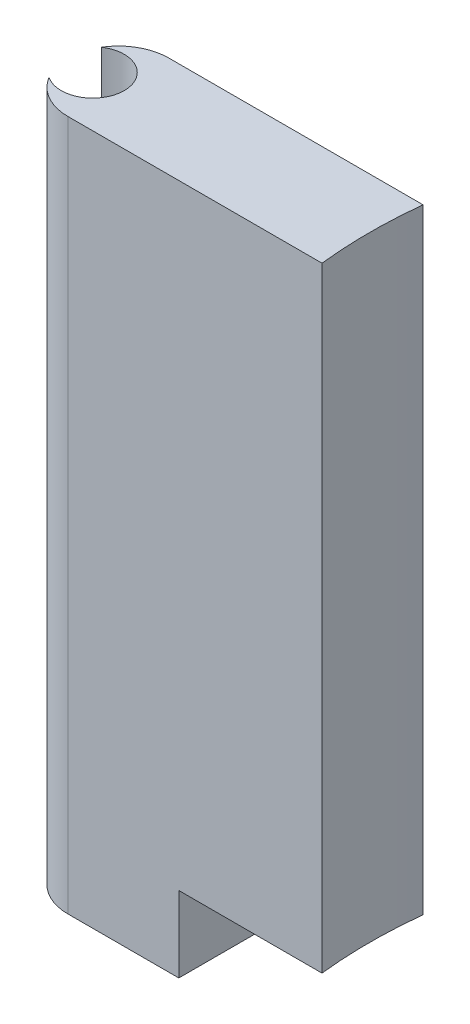
ISO-10303-21;
HEADER;
FILE_DESCRIPTION(('STEP AP214'),'2;1');
FILE_NAME('part.step','',(''),(''),'','','');
FILE_SCHEMA(('AUTOMOTIVE_DESIGN { 1 0 10303 214 1 1 1 1 }'));
ENDSEC;
DATA;
#1=APPLICATION_CONTEXT('core data for automotive mechanical design processes');
#2=APPLICATION_PROTOCOL_DEFINITION('international standard','automotive_design',2000,#1);
#3=PRODUCT_CONTEXT('',#1,'mechanical');
#4=PRODUCT('Part','Part','',(#3));
#5=PRODUCT_RELATED_PRODUCT_CATEGORY('part','',(#4));
#6=PRODUCT_DEFINITION_FORMATION('','',#4);
#7=PRODUCT_DEFINITION_CONTEXT('part definition',#1,'design');
#8=PRODUCT_DEFINITION('design','',#6,#7);
#9=PRODUCT_DEFINITION_SHAPE('','',#8);
#10=(LENGTH_UNIT() NAMED_UNIT(*) SI_UNIT(.MILLI.,.METRE.));
#11=(NAMED_UNIT(*) PLANE_ANGLE_UNIT() SI_UNIT($,.RADIAN.));
#12=(NAMED_UNIT(*) SI_UNIT($,.STERADIAN.) SOLID_ANGLE_UNIT());
#13=UNCERTAINTY_MEASURE_WITH_UNIT(LENGTH_MEASURE(1.E-05),#10,'distance_accuracy_value','');
#14=(GEOMETRIC_REPRESENTATION_CONTEXT(3) GLOBAL_UNCERTAINTY_ASSIGNED_CONTEXT((#13)) GLOBAL_UNIT_ASSIGNED_CONTEXT((#10,
#11,#12)) REPRESENTATION_CONTEXT('',''));
#15=CARTESIAN_POINT('',(0.,0.,0.));
#16=DIRECTION('',(0.,0.,1.));
#17=DIRECTION('',(1.,0.,0.));
#18=AXIS2_PLACEMENT_3D('',#15,#16,#17);
#19=CARTESIAN_POINT('',(-107.430277486441,104.14,0.));
#20=DIRECTION('',(0.,-1.,0.));
#21=DIRECTION('',(0.,0.,-1.));
#22=AXIS2_PLACEMENT_3D('',#19,#20,#21);
#23=CYLINDRICAL_SURFACE('',#22,7.62);
#24=CARTESIAN_POINT('',(-107.430277486441,0.,0.));
#25=DIRECTION('',(0.,1.,0.));
#26=DIRECTION('',(0.,0.,1.));
#27=AXIS2_PLACEMENT_3D('',#24,#25,#26);
#28=CIRCLE('',#27,7.62);
#29=CARTESIAN_POINT('',(-107.430277486441,0.,-7.62));
#30=VERTEX_POINT('',#29);
#31=CARTESIAN_POINT('',(-113.952086328642,0.,-3.94086404558503));
#32=VERTEX_POINT('',#31);
#33=EDGE_CURVE('E11',#30,#32,#28,.T.);
#34=ORIENTED_EDGE('',*,*,#33,.T.);
#35=DIRECTION('',(0.,1.,0.));
#36=VECTOR('',#35,1.);
#37=CARTESIAN_POINT('',(-113.952086328642,52.07,-3.94086404558503));
#38=LINE('',#37,#36);
#39=CARTESIAN_POINT('',(-113.952086328642,104.14,-3.94086404558503));
#40=VERTEX_POINT('',#39);
#41=EDGE_CURVE('E27',#32,#40,#38,.T.);
#42=ORIENTED_EDGE('',*,*,#41,.T.);
#43=CARTESIAN_POINT('',(-107.430277486441,104.14,0.));
#44=DIRECTION('',(0.,1.,0.));
#45=DIRECTION('',(0.,0.,1.));
#46=AXIS2_PLACEMENT_3D('',#43,#44,#45);
#47=CIRCLE('',#46,7.62);
#48=CARTESIAN_POINT('',(-107.430277486441,104.14,-7.62));
#49=VERTEX_POINT('',#48);
#50=EDGE_CURVE('E181',#49,#40,#47,.T.);
#51=ORIENTED_EDGE('',*,*,#50,.F.);
#52=DIRECTION('',(0.,-1.,0.));
#53=VECTOR('',#52,1.);
#54=CARTESIAN_POINT('',(-107.430277486441,104.14,-7.62));
#55=LINE('',#54,#53);
#56=EDGE_CURVE('E178',#49,#30,#55,.T.);
#57=ORIENTED_EDGE('',*,*,#56,.T.);
#58=EDGE_LOOP('',(#34,#42,#51,#57));
#59=FACE_BOUND('',#58,.T.);
#60=ADVANCED_FACE('F17',(#59),#23,.T.);
#61=CARTESIAN_POINT('',(-113.952086328642,104.14,3.94086404558503));
#62=VERTEX_POINT('',#61);
#63=CARTESIAN_POINT('',(-107.430277486441,104.14,7.62));
#64=VERTEX_POINT('',#63);
#65=EDGE_CURVE('E177',#62,#64,#47,.T.);
#66=ORIENTED_EDGE('',*,*,#65,.F.);
#67=DIRECTION('',(0.,1.,0.));
#68=VECTOR('',#67,1.);
#69=CARTESIAN_POINT('',(-113.952086328642,52.07,3.94086404558503));
#70=LINE('',#69,#68);
#71=CARTESIAN_POINT('',(-113.952086328642,0.,3.94086404558503));
#72=VERTEX_POINT('',#71);
#73=EDGE_CURVE('E174',#62,#72,#70,.F.);
#74=ORIENTED_EDGE('',*,*,#73,.T.);
#75=CARTESIAN_POINT('',(-107.430277486441,0.,7.62));
#76=VERTEX_POINT('',#75);
#77=EDGE_CURVE('E21',#72,#76,#28,.T.);
#78=ORIENTED_EDGE('',*,*,#77,.T.);
#79=DIRECTION('',(0.,-1.,0.));
#80=VECTOR('',#79,1.);
#81=CARTESIAN_POINT('',(-107.430277486441,104.14,7.62));
#82=LINE('',#81,#80);
#83=EDGE_CURVE('E170',#64,#76,#82,.T.);
#84=ORIENTED_EDGE('',*,*,#83,.F.);
#85=EDGE_LOOP('',(#66,#74,#78,#84));
#86=FACE_BOUND('',#85,.T.);
#87=ADVANCED_FACE('F19',(#86),#23,.T.);
#88=CARTESIAN_POINT('',(-107.430277486441,104.14,7.62));
#89=DIRECTION('',(0.,0.,-1.));
#90=DIRECTION('',(-1.,0.,0.));
#91=AXIS2_PLACEMENT_3D('',#88,#89,#90);
#92=PLANE('',#91);
#93=DIRECTION('',(1.,0.,0.));
#94=VECTOR('',#93,1.);
#95=CARTESIAN_POINT('',(-107.430277486441,0.,7.62));
#96=LINE('',#95,#94);
#97=CARTESIAN_POINT('',(-90.701187486441,0.,7.62));
#98=VERTEX_POINT('',#97);
#99=EDGE_CURVE('E167',#76,#98,#96,.T.);
#100=ORIENTED_EDGE('',*,*,#99,.T.);
#101=DIRECTION('',(0.,-1.,0.));
#102=VECTOR('',#101,1.);
#103=CARTESIAN_POINT('',(-90.701187486441,11.43,7.62));
#104=LINE('',#103,#102);
#105=CARTESIAN_POINT('',(-90.701187486441,11.43,7.62));
#106=VERTEX_POINT('',#105);
#107=EDGE_CURVE('E124',#106,#98,#104,.T.);
#108=ORIENTED_EDGE('',*,*,#107,.F.);
#109=DIRECTION('',(-1.,0.,0.));
#110=VECTOR('',#109,1.);
#111=CARTESIAN_POINT('',(-69.111187486441,11.43,7.62));
#112=LINE('',#111,#110);
#113=CARTESIAN_POINT('',(-69.111187486441,11.43,7.62));
#114=VERTEX_POINT('',#113);
#115=EDGE_CURVE('E161',#114,#106,#112,.T.);
#116=ORIENTED_EDGE('',*,*,#115,.F.);
#117=DIRECTION('',(0.,-1.,0.));
#118=VECTOR('',#117,1.);
#119=CARTESIAN_POINT('',(-69.111187486441,104.14,7.62));
#120=LINE('',#119,#118);
#121=CARTESIAN_POINT('',(-69.111187486441,104.14,7.62));
#122=VERTEX_POINT('',#121);
#123=EDGE_CURVE('E157',#122,#114,#120,.T.);
#124=ORIENTED_EDGE('',*,*,#123,.F.);
#125=DIRECTION('',(1.,0.,0.));
#126=VECTOR('',#125,1.);
#127=CARTESIAN_POINT('',(-107.430277486441,104.14,7.62));
#128=LINE('',#127,#126);
#129=EDGE_CURVE('E153',#64,#122,#128,.T.);
#130=ORIENTED_EDGE('',*,*,#129,.F.);
#131=ORIENTED_EDGE('',*,*,#83,.T.);
#132=EDGE_LOOP('',(#100,#108,#116,#124,#130,#131));
#133=FACE_BOUND('',#132,.T.);
#134=ADVANCED_FACE('F220',(#133),#92,.F.);
#135=CARTESIAN_POINT('',(0.,104.14,0.));
#136=DIRECTION('',(0.,-1.,0.));
#137=DIRECTION('',(0.,0.,-1.));
#138=AXIS2_PLACEMENT_3D('',#135,#136,#137);
#139=CYLINDRICAL_SURFACE('',#138,69.5299981);
#140=ORIENTED_EDGE('',*,*,#123,.T.);
#141=CARTESIAN_POINT('',(0.,11.43,0.));
#142=DIRECTION('',(0.,1.,0.));
#143=DIRECTION('',(0.,0.,1.));
#144=AXIS2_PLACEMENT_3D('',#141,#142,#143);
#145=CIRCLE('',#144,69.5299981);
#146=CARTESIAN_POINT('',(-69.111187486441,11.43,-7.62));
#147=VERTEX_POINT('',#146);
#148=EDGE_CURVE('E150',#114,#147,#145,.F.);
#149=ORIENTED_EDGE('',*,*,#148,.T.);
#150=DIRECTION('',(0.,-1.,0.));
#151=VECTOR('',#150,1.);
#152=CARTESIAN_POINT('',(-69.111187486441,104.14,-7.62));
#153=LINE('',#152,#151);
#154=CARTESIAN_POINT('',(-69.111187486441,104.14,-7.62));
#155=VERTEX_POINT('',#154);
#156=EDGE_CURVE('E147',#155,#147,#153,.T.);
#157=ORIENTED_EDGE('',*,*,#156,.F.);
#158=CARTESIAN_POINT('',(0.,104.14,0.));
#159=DIRECTION('',(0.,-1.,0.));
#160=DIRECTION('',(0.,0.,1.));
#161=AXIS2_PLACEMENT_3D('',#158,#159,#160);
#162=CIRCLE('',#161,69.5299981);
#163=EDGE_CURVE('E143',#122,#155,#162,.T.);
#164=ORIENTED_EDGE('',*,*,#163,.F.);
#165=EDGE_LOOP('',(#140,#149,#157,#164));
#166=FACE_BOUND('',#165,.T.);
#167=ADVANCED_FACE('F224',(#166),#139,.F.);
#168=CARTESIAN_POINT('',(-107.430277486441,104.14,-7.62));
#169=DIRECTION('',(0.,0.,1.));
#170=DIRECTION('',(1.,0.,0.));
#171=AXIS2_PLACEMENT_3D('',#168,#169,#170);
#172=PLANE('',#171);
#173=DIRECTION('',(1.,0.,0.));
#174=VECTOR('',#173,1.);
#175=CARTESIAN_POINT('',(-69.111187486441,11.43,-7.62));
#176=LINE('',#175,#174);
#177=CARTESIAN_POINT('',(-90.701187486441,11.43,-7.62));
#178=VERTEX_POINT('',#177);
#179=EDGE_CURVE('E107',#178,#147,#176,.T.);
#180=ORIENTED_EDGE('',*,*,#179,.F.);
#181=DIRECTION('',(0.,-1.,0.));
#182=VECTOR('',#181,1.);
#183=CARTESIAN_POINT('',(-90.701187486441,11.43,-7.62));
#184=LINE('',#183,#182);
#185=CARTESIAN_POINT('',(-90.701187486441,0.,-7.62));
#186=VERTEX_POINT('',#185);
#187=EDGE_CURVE('E100',#178,#186,#184,.T.);
#188=ORIENTED_EDGE('',*,*,#187,.T.);
#189=DIRECTION('',(-1.,0.,0.));
#190=VECTOR('',#189,1.);
#191=CARTESIAN_POINT('',(-107.430277486441,0.,-7.62));
#192=LINE('',#191,#190);
#193=EDGE_CURVE('E104',#186,#30,#192,.T.);
#194=ORIENTED_EDGE('',*,*,#193,.T.);
#195=ORIENTED_EDGE('',*,*,#56,.F.);
#196=DIRECTION('',(-1.,0.,0.));
#197=VECTOR('',#196,1.);
#198=CARTESIAN_POINT('',(-107.430277486441,104.14,-7.62));
#199=LINE('',#198,#197);
#200=EDGE_CURVE('E121',#155,#49,#199,.T.);
#201=ORIENTED_EDGE('',*,*,#200,.F.);
#202=ORIENTED_EDGE('',*,*,#156,.T.);
#203=EDGE_LOOP('',(#180,#188,#194,#195,#201,#202));
#204=FACE_BOUND('',#203,.T.);
#205=ADVANCED_FACE('F102',(#204),#172,.F.);
#206=CARTESIAN_POINT('',(-107.430277486441,104.14,0.));
#207=DIRECTION('',(0.,1.,0.));
#208=DIRECTION('',(0.,0.,1.));
#209=AXIS2_PLACEMENT_3D('',#206,#207,#208);
#210=PLANE('',#209);
#211=CARTESIAN_POINT('',(-111.300277586441,104.14,0.));
#212=DIRECTION('',(0.,1.,0.));
#213=DIRECTION('',(0.,0.,1.));
#214=AXIS2_PLACEMENT_3D('',#211,#212,#213);
#215=CIRCLE('',#214,4.749999898);
#216=EDGE_CURVE('E126',#62,#40,#215,.T.);
#217=ORIENTED_EDGE('',*,*,#216,.F.);
#218=ORIENTED_EDGE('',*,*,#65,.T.);
#219=ORIENTED_EDGE('',*,*,#129,.T.);
#220=ORIENTED_EDGE('',*,*,#163,.T.);
#221=ORIENTED_EDGE('',*,*,#200,.T.);
#222=ORIENTED_EDGE('',*,*,#50,.T.);
#223=EDGE_LOOP('',(#217,#218,#219,#220,#221,#222));
#224=FACE_BOUND('',#223,.T.);
#225=ADVANCED_FACE('F190',(#224),#210,.T.);
#226=CARTESIAN_POINT('',(-107.430277486441,0.,0.));
#227=DIRECTION('',(0.,1.,0.));
#228=DIRECTION('',(0.,0.,1.));
#229=AXIS2_PLACEMENT_3D('',#226,#227,#228);
#230=PLANE('',#229);
#231=ORIENTED_EDGE('',*,*,#193,.F.);
#232=DIRECTION('',(0.,0.,-1.));
#233=VECTOR('',#232,1.);
#234=CARTESIAN_POINT('',(-90.701187486441,0.,7.62));
#235=LINE('',#234,#233);
#236=EDGE_CURVE('E118',#98,#186,#235,.T.);
#237=ORIENTED_EDGE('',*,*,#236,.F.);
#238=ORIENTED_EDGE('',*,*,#99,.F.);
#239=ORIENTED_EDGE('',*,*,#77,.F.);
#240=CARTESIAN_POINT('',(-111.300277586441,0.,0.));
#241=DIRECTION('',(0.,1.,0.));
#242=DIRECTION('',(0.,0.,1.));
#243=AXIS2_PLACEMENT_3D('',#240,#241,#242);
#244=CIRCLE('',#243,4.749999898);
#245=EDGE_CURVE('E127',#72,#32,#244,.T.);
#246=ORIENTED_EDGE('',*,*,#245,.T.);
#247=ORIENTED_EDGE('',*,*,#33,.F.);
#248=EDGE_LOOP('',(#231,#237,#238,#239,#246,#247));
#249=FACE_BOUND('',#248,.T.);
#250=ADVANCED_FACE('F116',(#249),#230,.F.);
#251=CARTESIAN_POINT('',(-111.300277586441,0.,0.));
#252=DIRECTION('',(0.,1.,0.));
#253=DIRECTION('',(0.,0.,1.));
#254=AXIS2_PLACEMENT_3D('',#251,#252,#253);
#255=CYLINDRICAL_SURFACE('',#254,4.749999898);
#256=ORIENTED_EDGE('',*,*,#245,.F.);
#257=ORIENTED_EDGE('',*,*,#73,.F.);
#258=ORIENTED_EDGE('',*,*,#216,.T.);
#259=ORIENTED_EDGE('',*,*,#41,.F.);
#260=EDGE_LOOP('',(#256,#257,#258,#259));
#261=FACE_BOUND('',#260,.T.);
#262=ADVANCED_FACE('F195',(#261),#255,.F.);
#263=CARTESIAN_POINT('',(0.,11.43,0.));
#264=DIRECTION('',(0.,1.,0.));
#265=DIRECTION('',(0.,0.,1.));
#266=AXIS2_PLACEMENT_3D('',#263,#264,#265);
#267=PLANE('',#266);
#268=CARTESIAN_POINT('',(-77.3230717780463,11.43,0.));
#269=DIRECTION('',(0.,-1.,0.));
#270=DIRECTION('',(0.,0.,-1.));
#271=AXIS2_PLACEMENT_3D('',#268,#269,#270);
#272=CIRCLE('',#271,3.);
#273=CARTESIAN_POINT('',(-77.3230717780463,11.43,-2.99999999999999));
#274=VERTEX_POINT('',#273);
#275=EDGE_CURVE('E134',#274,#274,#272,.T.);
#276=ORIENTED_EDGE('',*,*,#275,.F.);
#277=EDGE_LOOP('',(#276));
#278=FACE_BOUND('',#277,.T.);
#279=ORIENTED_EDGE('',*,*,#115,.T.);
#280=DIRECTION('',(0.,0.,-1.));
#281=VECTOR('',#280,1.);
#282=CARTESIAN_POINT('',(-90.701187486441,11.43,7.62));
#283=LINE('',#282,#281);
#284=EDGE_CURVE('E266',#106,#178,#283,.T.);
#285=ORIENTED_EDGE('',*,*,#284,.T.);
#286=ORIENTED_EDGE('',*,*,#179,.T.);
#287=ORIENTED_EDGE('',*,*,#148,.F.);
#288=EDGE_LOOP('',(#279,#285,#286,#287));
#289=FACE_BOUND('',#288,.T.);
#290=ADVANCED_FACE('F247',(#278,#289),#267,.F.);
#291=CARTESIAN_POINT('',(-90.701187486441,11.43,7.62));
#292=DIRECTION('',(-1.,0.,0.));
#293=DIRECTION('',(0.,0.,1.));
#294=AXIS2_PLACEMENT_3D('',#291,#292,#293);
#295=PLANE('',#294);
#296=ORIENTED_EDGE('',*,*,#236,.T.);
#297=ORIENTED_EDGE('',*,*,#187,.F.);
#298=ORIENTED_EDGE('',*,*,#284,.F.);
#299=ORIENTED_EDGE('',*,*,#107,.T.);
#300=EDGE_LOOP('',(#296,#297,#298,#299));
#301=FACE_BOUND('',#300,.T.);
#302=ADVANCED_FACE('F123',(#301),#295,.F.);
#303=CARTESIAN_POINT('',(-77.3230717780463,30.48,0.));
#304=DIRECTION('',(0.,-1.,0.));
#305=DIRECTION('',(0.,0.,-1.));
#306=AXIS2_PLACEMENT_3D('',#303,#304,#305);
#307=CYLINDRICAL_SURFACE('',#306,3.);
#308=CARTESIAN_POINT('',(-77.3230717780463,30.48,0.));
#309=DIRECTION('',(0.,-1.,0.));
#310=DIRECTION('',(0.,0.,-1.));
#311=AXIS2_PLACEMENT_3D('',#308,#309,#310);
#312=CIRCLE('',#311,3.);
#313=CARTESIAN_POINT('',(-77.3230717780463,30.48,-2.99999999999999));
#314=VERTEX_POINT('',#313);
#315=EDGE_CURVE('E264',#314,#314,#312,.T.);
#316=ORIENTED_EDGE('',*,*,#315,.F.);
#317=EDGE_LOOP('',(#316));
#318=FACE_BOUND('',#317,.T.);
#319=ORIENTED_EDGE('',*,*,#275,.T.);
#320=EDGE_LOOP('',(#319));
#321=FACE_BOUND('',#320,.T.);
#322=ADVANCED_FACE('F253',(#318,#321),#307,.F.);
#323=CARTESIAN_POINT('',(-77.3230717780463,30.48,0.));
#324=DIRECTION('',(0.,-1.,0.));
#325=DIRECTION('',(0.,0.,-1.));
#326=AXIS2_PLACEMENT_3D('',#323,#324,#325);
#327=PLANE('',#326);
#328=ORIENTED_EDGE('',*,*,#315,.T.);
#329=EDGE_LOOP('',(#328));
#330=FACE_BOUND('',#329,.T.);
#331=ADVANCED_FACE('F256',(#330),#327,.T.);
#332=CLOSED_SHELL('',(#60,#87,#134,#167,#205,#225,#250,#262,#290,#302,#322,#331));
#333=MANIFOLD_SOLID_BREP('B1',#332);
#334=ADVANCED_BREP_SHAPE_REPRESENTATION('',(#18,#333),#14);
#335=SHAPE_DEFINITION_REPRESENTATION(#9,#334);
ENDSEC;
END-ISO-10303-21;
